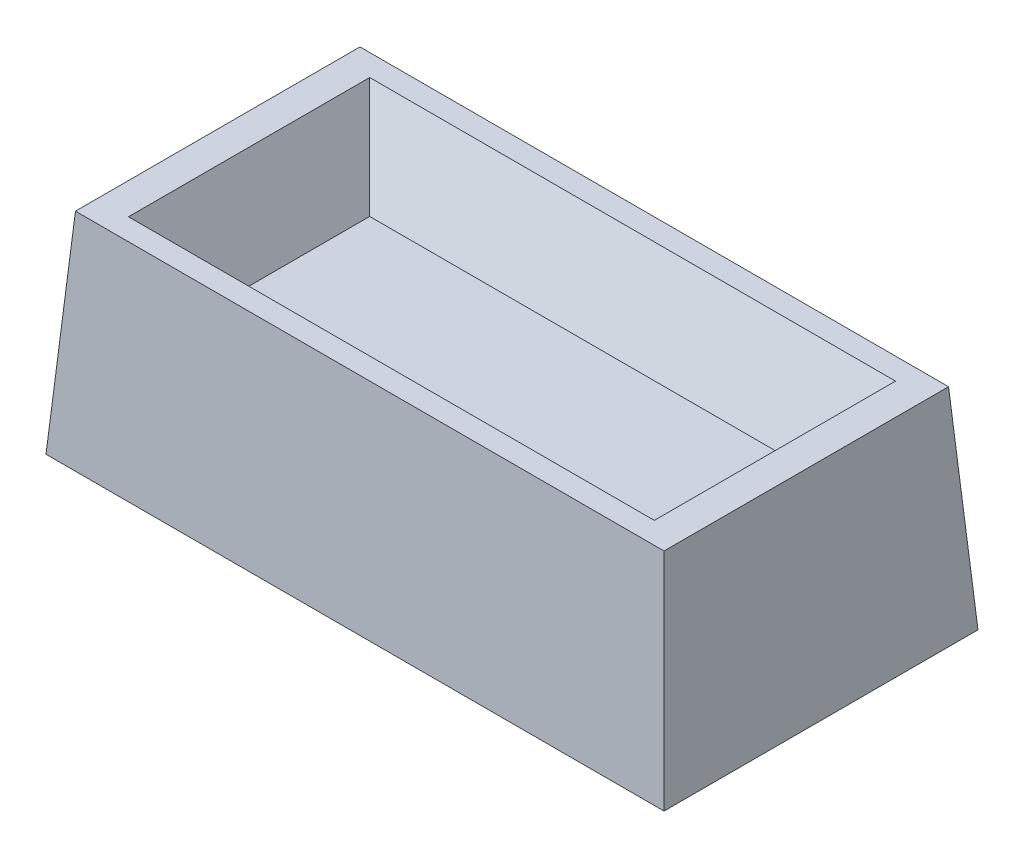
ISO-10303-21;
HEADER;
FILE_DESCRIPTION(('STEP AP214'),'2;1');
FILE_NAME('part.step','',(''),(''),'','','');
FILE_SCHEMA(('AUTOMOTIVE_DESIGN { 1 0 10303 214 1 1 1 1 }'));
ENDSEC;
DATA;
#1=APPLICATION_CONTEXT('core data for automotive mechanical design processes');
#2=APPLICATION_PROTOCOL_DEFINITION('international standard','automotive_design',2000,#1);
#3=PRODUCT_CONTEXT('',#1,'mechanical');
#4=PRODUCT('Part','Part','',(#3));
#5=PRODUCT_RELATED_PRODUCT_CATEGORY('part','',(#4));
#6=PRODUCT_DEFINITION_FORMATION('','',#4);
#7=PRODUCT_DEFINITION_CONTEXT('part definition',#1,'design');
#8=PRODUCT_DEFINITION('design','',#6,#7);
#9=PRODUCT_DEFINITION_SHAPE('','',#8);
#10=(LENGTH_UNIT() NAMED_UNIT(*) SI_UNIT(.MILLI.,.METRE.));
#11=(NAMED_UNIT(*) PLANE_ANGLE_UNIT() SI_UNIT($,.RADIAN.));
#12=(NAMED_UNIT(*) SI_UNIT($,.STERADIAN.) SOLID_ANGLE_UNIT());
#13=UNCERTAINTY_MEASURE_WITH_UNIT(LENGTH_MEASURE(1.E-05),#10,'distance_accuracy_value','');
#14=(GEOMETRIC_REPRESENTATION_CONTEXT(3) GLOBAL_UNCERTAINTY_ASSIGNED_CONTEXT((#13)) GLOBAL_UNIT_ASSIGNED_CONTEXT((#10,
#11,#12)) REPRESENTATION_CONTEXT('',''));
#15=CARTESIAN_POINT('',(0.,0.,0.));
#16=DIRECTION('',(0.,0.,1.));
#17=DIRECTION('',(1.,0.,0.));
#18=AXIS2_PLACEMENT_3D('',#15,#16,#17);
#19=CARTESIAN_POINT('',(0.,0.,0.));
#20=DIRECTION('',(0.,-1.,0.));
#21=DIRECTION('',(0.,0.,-1.));
#22=AXIS2_PLACEMENT_3D('',#19,#20,#21);
#23=PLANE('',#22);
#24=DIRECTION('',(0.,0.,-1.));
#25=VECTOR('',#24,1.);
#26=CARTESIAN_POINT('',(102.892841401862,0.,52.2673742227546));
#27=LINE('',#26,#25);
#28=CARTESIAN_POINT('',(102.892841401862,0.,52.2673742227546));
#29=VERTEX_POINT('',#28);
#30=CARTESIAN_POINT('',(102.892841401862,0.,-52.2673742227546));
#31=VERTEX_POINT('',#30);
#32=EDGE_CURVE('E240',#29,#31,#27,.T.);
#33=ORIENTED_EDGE('',*,*,#32,.F.);
#34=DIRECTION('',(1.,0.,0.));
#35=VECTOR('',#34,1.);
#36=CARTESIAN_POINT('',(-102.892841401862,0.,52.2673742227546));
#37=LINE('',#36,#35);
#38=CARTESIAN_POINT('',(-102.892841401862,0.,52.2673742227546));
#39=VERTEX_POINT('',#38);
#40=EDGE_CURVE('E247',#39,#29,#37,.T.);
#41=ORIENTED_EDGE('',*,*,#40,.F.);
#42=DIRECTION('',(0.,0.,1.));
#43=VECTOR('',#42,1.);
#44=CARTESIAN_POINT('',(-102.892841401862,0.,52.2673742227546));
#45=LINE('',#44,#43);
#46=CARTESIAN_POINT('',(-102.892841401862,0.,-52.2673742227546));
#47=VERTEX_POINT('',#46);
#48=EDGE_CURVE('E245',#47,#39,#45,.T.);
#49=ORIENTED_EDGE('',*,*,#48,.F.);
#50=DIRECTION('',(-1.,0.,0.));
#51=VECTOR('',#50,1.);
#52=CARTESIAN_POINT('',(-102.892841401862,0.,-52.2673742227546));
#53=LINE('',#52,#51);
#54=EDGE_CURVE('E243',#31,#47,#53,.T.);
#55=ORIENTED_EDGE('',*,*,#54,.F.);
#56=EDGE_LOOP('',(#33,#41,#49,#55));
#57=FACE_BOUND('',#56,.T.);
#58=DIRECTION('',(-1.,0.,0.));
#59=VECTOR('',#58,1.);
#60=CARTESIAN_POINT('',(0.,0.,50.6759977095508));
#61=LINE('',#60,#59);
#62=CARTESIAN_POINT('',(-101.301464888659,0.,50.6759977095508));
#63=VERTEX_POINT('',#62);
#64=CARTESIAN_POINT('',(101.301464888659,0.,50.6759977095508));
#65=VERTEX_POINT('',#64);
#66=EDGE_CURVE('E172',#63,#65,#61,.F.);
#67=ORIENTED_EDGE('',*,*,#66,.T.);
#68=DIRECTION('',(0.,0.,1.));
#69=VECTOR('',#68,1.);
#70=CARTESIAN_POINT('',(101.301464888659,0.,0.));
#71=LINE('',#70,#69);
#72=CARTESIAN_POINT('',(101.301464888659,0.,-50.6759977095508));
#73=VERTEX_POINT('',#72);
#74=EDGE_CURVE('E210',#65,#73,#71,.F.);
#75=ORIENTED_EDGE('',*,*,#74,.T.);
#76=DIRECTION('',(1.,0.,0.));
#77=VECTOR('',#76,1.);
#78=CARTESIAN_POINT('',(0.,0.,-50.6759977095508));
#79=LINE('',#78,#77);
#80=CARTESIAN_POINT('',(-101.301464888659,0.,-50.6759977095508));
#81=VERTEX_POINT('',#80);
#82=EDGE_CURVE('E176',#73,#81,#79,.F.);
#83=ORIENTED_EDGE('',*,*,#82,.T.);
#84=DIRECTION('',(0.,0.,-1.));
#85=VECTOR('',#84,1.);
#86=CARTESIAN_POINT('',(-101.301464888659,0.,0.));
#87=LINE('',#86,#85);
#88=EDGE_CURVE('E50',#81,#63,#87,.F.);
#89=ORIENTED_EDGE('',*,*,#88,.T.);
#90=EDGE_LOOP('',(#67,#75,#83,#89));
#91=FACE_BOUND('',#90,.T.);
#92=ADVANCED_FACE('F33',(#57,#91),#23,.T.);
#93=CARTESIAN_POINT('',(102.892841401862,0.,52.2673742227546));
#94=DIRECTION('',(0.997564050259824,0.0697564737441253,0.));
#95=DIRECTION('',(-0.0697564737441253,0.997564050259824,0.));
#96=AXIS2_PLACEMENT_3D('',#93,#94,#95);
#97=PLANE('',#96);
#98=ORIENTED_EDGE('',*,*,#32,.T.);
#99=DIRECTION('',(0.0695873743166647,-0.995145815783508,-0.0695873743166647));
#100=VECTOR('',#99,1.);
#101=CARTESIAN_POINT('',(101.896344263182,14.2505730060454,-51.2708770840736));
#102=LINE('',#101,#100);
#103=CARTESIAN_POINT('',(97.9906921773746,70.104,-47.3652249982668));
#104=VERTEX_POINT('',#103);
#105=EDGE_CURVE('E11',#104,#31,#102,.T.);
#106=ORIENTED_EDGE('',*,*,#105,.F.);
#107=DIRECTION('',(0.,0.,1.));
#108=VECTOR('',#107,1.);
#109=CARTESIAN_POINT('',(97.9906921773746,70.104,0.));
#110=LINE('',#109,#108);
#111=CARTESIAN_POINT('',(97.9906921773746,70.104,47.3652249982668));
#112=VERTEX_POINT('',#111);
#113=EDGE_CURVE('E248',#112,#104,#110,.F.);
#114=ORIENTED_EDGE('',*,*,#113,.F.);
#115=DIRECTION('',(0.0695873743166647,-0.995145815783508,0.0695873743166647));
#116=VECTOR('',#115,1.);
#117=CARTESIAN_POINT('',(102.892841401862,0.,52.2673742227546));
#118=LINE('',#117,#116);
#119=EDGE_CURVE('E250',#112,#29,#118,.T.);
#120=ORIENTED_EDGE('',*,*,#119,.T.);
#121=EDGE_LOOP('',(#98,#106,#114,#120));
#122=FACE_BOUND('',#121,.T.);
#123=ADVANCED_FACE('F299',(#122),#97,.T.);
#124=CARTESIAN_POINT('',(-102.892841401862,0.,-52.2673742227546));
#125=DIRECTION('',(0.,0.0697564737441253,-0.997564050259824));
#126=DIRECTION('',(0.,0.997564050259824,0.0697564737441253));
#127=AXIS2_PLACEMENT_3D('',#124,#125,#126);
#128=PLANE('',#127);
#129=ORIENTED_EDGE('',*,*,#54,.T.);
#130=DIRECTION('',(-0.0695873743166647,-0.995145815783508,-0.0695873743166647));
#131=VECTOR('',#130,1.);
#132=CARTESIAN_POINT('',(-102.386642057479,7.23898788339008,-51.7611748783715));
#133=LINE('',#132,#131);
#134=CARTESIAN_POINT('',(-97.9906921773746,70.104,-47.3652249982668));
#135=VERTEX_POINT('',#134);
#136=EDGE_CURVE('E42',#135,#47,#133,.T.);
#137=ORIENTED_EDGE('',*,*,#136,.F.);
#138=DIRECTION('',(1.,0.,0.));
#139=VECTOR('',#138,1.);
#140=CARTESIAN_POINT('',(0.,70.104,-47.3652249982668));
#141=LINE('',#140,#139);
#142=EDGE_CURVE('E261',#104,#135,#141,.F.);
#143=ORIENTED_EDGE('',*,*,#142,.F.);
#144=ORIENTED_EDGE('',*,*,#105,.T.);
#145=EDGE_LOOP('',(#129,#137,#143,#144));
#146=FACE_BOUND('',#145,.T.);
#147=ADVANCED_FACE('F307',(#146),#128,.T.);
#148=CARTESIAN_POINT('',(-102.892841401862,0.,52.2673742227546));
#149=DIRECTION('',(-0.997564050259824,0.0697564737441253,0.));
#150=DIRECTION('',(-0.0697564737441253,-0.997564050259824,0.));
#151=AXIS2_PLACEMENT_3D('',#148,#149,#150);
#152=PLANE('',#151);
#153=ORIENTED_EDGE('',*,*,#48,.T.);
#154=DIRECTION('',(-0.0695873743166647,-0.995145815783508,0.0695873743166647));
#155=VECTOR('',#154,1.);
#156=CARTESIAN_POINT('',(-102.892841401862,0.,52.2673742227546));
#157=LINE('',#156,#155);
#158=CARTESIAN_POINT('',(-97.9906921773746,70.104,47.3652249982668));
#159=VERTEX_POINT('',#158);
#160=EDGE_CURVE('E253',#159,#39,#157,.T.);
#161=ORIENTED_EDGE('',*,*,#160,.F.);
#162=DIRECTION('',(0.,0.,-1.));
#163=VECTOR('',#162,1.);
#164=CARTESIAN_POINT('',(-97.9906921773746,70.104,0.));
#165=LINE('',#164,#163);
#166=EDGE_CURVE('E263',#135,#159,#165,.F.);
#167=ORIENTED_EDGE('',*,*,#166,.F.);
#168=ORIENTED_EDGE('',*,*,#136,.T.);
#169=EDGE_LOOP('',(#153,#161,#167,#168));
#170=FACE_BOUND('',#169,.T.);
#171=ADVANCED_FACE('F316',(#170),#152,.T.);
#172=CARTESIAN_POINT('',(-102.892841401862,0.,52.2673742227546));
#173=DIRECTION('',(0.,0.0697564737441253,0.997564050259824));
#174=DIRECTION('',(0.,-0.997564050259824,0.0697564737441253));
#175=AXIS2_PLACEMENT_3D('',#172,#173,#174);
#176=PLANE('',#175);
#177=ORIENTED_EDGE('',*,*,#40,.T.);
#178=ORIENTED_EDGE('',*,*,#119,.F.);
#179=DIRECTION('',(-1.,0.,0.));
#180=VECTOR('',#179,1.);
#181=CARTESIAN_POINT('',(0.,70.104,47.3652249982668));
#182=LINE('',#181,#180);
#183=EDGE_CURVE('E254',#159,#112,#182,.F.);
#184=ORIENTED_EDGE('',*,*,#183,.F.);
#185=ORIENTED_EDGE('',*,*,#160,.T.);
#186=EDGE_LOOP('',(#177,#178,#184,#185));
#187=FACE_BOUND('',#186,.T.);
#188=ADVANCED_FACE('F296',(#187),#176,.T.);
#189=CARTESIAN_POINT('',(0.,70.104,0.));
#190=DIRECTION('',(0.,-1.,0.));
#191=DIRECTION('',(0.,0.,-1.));
#192=AXIS2_PLACEMENT_3D('',#189,#190,#191);
#193=PLANE('',#192);
#194=DIRECTION('',(1.,0.,0.));
#195=VECTOR('',#194,1.);
#196=CARTESIAN_POINT('',(-72.8794328331901,70.104,-40.1517457005861));
#197=LINE('',#196,#195);
#198=CARTESIAN_POINT('',(87.5441296706066,70.104,-40.1517457005861));
#199=VERTEX_POINT('',#198);
#200=CARTESIAN_POINT('',(-87.5441296706066,70.104,-40.1517457005861));
#201=VERTEX_POINT('',#200);
#202=EDGE_CURVE('E179',#199,#201,#197,.F.);
#203=ORIENTED_EDGE('',*,*,#202,.F.);
#204=DIRECTION('',(0.,0.,1.));
#205=VECTOR('',#204,1.);
#206=CARTESIAN_POINT('',(87.5441296706066,70.104,25.4870488631695));
#207=LINE('',#206,#205);
#208=CARTESIAN_POINT('',(87.5441296706066,70.104,40.1517457005861));
#209=VERTEX_POINT('',#208);
#210=EDGE_CURVE('E37',#209,#199,#207,.F.);
#211=ORIENTED_EDGE('',*,*,#210,.F.);
#212=DIRECTION('',(-1.,0.,0.));
#213=VECTOR('',#212,1.);
#214=CARTESIAN_POINT('',(-72.8794328331901,70.104,40.1517457005861));
#215=LINE('',#214,#213);
#216=CARTESIAN_POINT('',(-87.5441296706066,70.104,40.1517457005861));
#217=VERTEX_POINT('',#216);
#218=EDGE_CURVE('E230',#217,#209,#215,.F.);
#219=ORIENTED_EDGE('',*,*,#218,.F.);
#220=DIRECTION('',(0.,0.,-1.));
#221=VECTOR('',#220,1.);
#222=CARTESIAN_POINT('',(-87.5441296706066,70.104,25.4870488631695));
#223=LINE('',#222,#221);
#224=EDGE_CURVE('E272',#201,#217,#223,.F.);
#225=ORIENTED_EDGE('',*,*,#224,.F.);
#226=EDGE_LOOP('',(#203,#211,#219,#225));
#227=FACE_BOUND('',#226,.T.);
#228=ORIENTED_EDGE('',*,*,#113,.T.);
#229=ORIENTED_EDGE('',*,*,#142,.T.);
#230=ORIENTED_EDGE('',*,*,#166,.T.);
#231=ORIENTED_EDGE('',*,*,#183,.T.);
#232=EDGE_LOOP('',(#228,#229,#230,#231));
#233=FACE_BOUND('',#232,.T.);
#234=ADVANCED_FACE('F282',(#227,#233),#193,.F.);
#235=CARTESIAN_POINT('',(72.8794328331901,44.704,25.4870488631695));
#236=DIRECTION('',(-0.866025403784438,0.500000000000001,0.));
#237=DIRECTION('',(-0.500000000000001,-0.866025403784438,0.));
#238=AXIS2_PLACEMENT_3D('',#235,#236,#237);
#239=PLANE('',#238);
#240=ORIENTED_EDGE('',*,*,#210,.T.);
#241=DIRECTION('',(0.447213595499959,0.774596669241482,-0.447213595499959));
#242=VECTOR('',#241,1.);
#243=CARTESIAN_POINT('',(62.6846132879222,27.0460545735999,-15.2922293179017));
#244=LINE('',#243,#242);
#245=CARTESIAN_POINT('',(72.8794328331901,44.704,-25.4870488631695));
#246=VERTEX_POINT('',#245);
#247=EDGE_CURVE('E239',#246,#199,#244,.T.);
#248=ORIENTED_EDGE('',*,*,#247,.F.);
#249=DIRECTION('',(0.,0.,-1.));
#250=VECTOR('',#249,1.);
#251=CARTESIAN_POINT('',(72.8794328331901,44.704,25.4870488631695));
#252=LINE('',#251,#250);
#253=CARTESIAN_POINT('',(72.8794328331901,44.704,25.4870488631695));
#254=VERTEX_POINT('',#253);
#255=EDGE_CURVE('E226',#254,#246,#252,.T.);
#256=ORIENTED_EDGE('',*,*,#255,.F.);
#257=DIRECTION('',(0.447213595499959,0.774596669241482,0.447213595499959));
#258=VECTOR('',#257,1.);
#259=CARTESIAN_POINT('',(43.727659699914,-5.78835219755546,-3.66472427010659));
#260=LINE('',#259,#258);
#261=EDGE_CURVE('E71',#254,#209,#260,.T.);
#262=ORIENTED_EDGE('',*,*,#261,.T.);
#263=EDGE_LOOP('',(#240,#248,#256,#262));
#264=FACE_BOUND('',#263,.T.);
#265=ADVANCED_FACE('F287',(#264),#239,.T.);
#266=CARTESIAN_POINT('',(-72.8794328331901,44.704,25.4870488631695));
#267=DIRECTION('',(0.,0.500000000000001,-0.866025403784438));
#268=DIRECTION('',(0.,0.866025403784438,0.500000000000001));
#269=AXIS2_PLACEMENT_3D('',#266,#267,#268);
#270=PLANE('',#269);
#271=ORIENTED_EDGE('',*,*,#218,.T.);
#272=ORIENTED_EDGE('',*,*,#261,.F.);
#273=DIRECTION('',(1.,0.,0.));
#274=VECTOR('',#273,1.);
#275=CARTESIAN_POINT('',(-72.8794328331901,44.704,25.4870488631695));
#276=LINE('',#275,#274);
#277=CARTESIAN_POINT('',(-72.8794328331901,44.704,25.4870488631695));
#278=VERTEX_POINT('',#277);
#279=EDGE_CURVE('E236',#278,#254,#276,.T.);
#280=ORIENTED_EDGE('',*,*,#279,.F.);
#281=DIRECTION('',(-0.447213595499959,0.774596669241482,0.447213595499959));
#282=VECTOR('',#281,1.);
#283=CARTESIAN_POINT('',(-72.8794328331901,44.704,25.4870488631695));
#284=LINE('',#283,#282);
#285=EDGE_CURVE('E79',#278,#217,#284,.T.);
#286=ORIENTED_EDGE('',*,*,#285,.T.);
#287=EDGE_LOOP('',(#271,#272,#280,#286));
#288=FACE_BOUND('',#287,.T.);
#289=ADVANCED_FACE('F289',(#288),#270,.T.);
#290=CARTESIAN_POINT('',(-72.8794328331901,44.704,25.4870488631695));
#291=DIRECTION('',(0.866025403784438,0.500000000000001,0.));
#292=DIRECTION('',(-0.500000000000001,0.866025403784438,0.));
#293=AXIS2_PLACEMENT_3D('',#290,#291,#292);
#294=PLANE('',#293);
#295=ORIENTED_EDGE('',*,*,#224,.T.);
#296=ORIENTED_EDGE('',*,*,#285,.F.);
#297=DIRECTION('',(0.,0.,1.));
#298=VECTOR('',#297,1.);
#299=CARTESIAN_POINT('',(-72.8794328331901,44.704,25.4870488631695));
#300=LINE('',#299,#298);
#301=CARTESIAN_POINT('',(-72.8794328331901,44.704,-25.4870488631695));
#302=VERTEX_POINT('',#301);
#303=EDGE_CURVE('E233',#302,#278,#300,.T.);
#304=ORIENTED_EDGE('',*,*,#303,.F.);
#305=DIRECTION('',(-0.447213595499959,0.774596669241482,-0.447213595499959));
#306=VECTOR('',#305,1.);
#307=CARTESIAN_POINT('',(-72.8794328331901,44.704,-25.4870488631695));
#308=LINE('',#307,#306);
#309=EDGE_CURVE('E268',#302,#201,#308,.T.);
#310=ORIENTED_EDGE('',*,*,#309,.T.);
#311=EDGE_LOOP('',(#295,#296,#304,#310));
#312=FACE_BOUND('',#311,.T.);
#313=ADVANCED_FACE('F35',(#312),#294,.T.);
#314=CARTESIAN_POINT('',(-72.8794328331901,44.704,-25.4870488631695));
#315=DIRECTION('',(0.,0.500000000000001,0.866025403784438));
#316=DIRECTION('',(0.,-0.866025403784438,0.500000000000001));
#317=AXIS2_PLACEMENT_3D('',#314,#315,#316);
#318=PLANE('',#317);
#319=ORIENTED_EDGE('',*,*,#202,.T.);
#320=ORIENTED_EDGE('',*,*,#309,.F.);
#321=DIRECTION('',(-1.,0.,0.));
#322=VECTOR('',#321,1.);
#323=CARTESIAN_POINT('',(-72.8794328331901,44.704,-25.4870488631695));
#324=LINE('',#323,#322);
#325=EDGE_CURVE('E229',#246,#302,#324,.T.);
#326=ORIENTED_EDGE('',*,*,#325,.F.);
#327=ORIENTED_EDGE('',*,*,#247,.T.);
#328=EDGE_LOOP('',(#319,#320,#326,#327));
#329=FACE_BOUND('',#328,.T.);
#330=ADVANCED_FACE('F277',(#329),#318,.T.);
#331=CARTESIAN_POINT('',(0.,44.704,0.));
#332=DIRECTION('',(0.,-1.,0.));
#333=DIRECTION('',(0.,0.,-1.));
#334=AXIS2_PLACEMENT_3D('',#331,#332,#333);
#335=PLANE('',#334);
#336=ORIENTED_EDGE('',*,*,#255,.T.);
#337=ORIENTED_EDGE('',*,*,#325,.T.);
#338=ORIENTED_EDGE('',*,*,#303,.T.);
#339=ORIENTED_EDGE('',*,*,#279,.T.);
#340=EDGE_LOOP('',(#336,#337,#338,#339));
#341=FACE_BOUND('',#340,.T.);
#342=ADVANCED_FACE('F286',(#341),#335,.F.);
#343=CARTESIAN_POINT('',(101.309208472075,-0.110738402068799,52.2673742227546));
#344=DIRECTION('',(0.997564050259824,0.0697564737441253,0.));
#345=DIRECTION('',(-0.0697564737441253,0.997564050259824,0.));
#346=AXIS2_PLACEMENT_3D('',#343,#344,#345);
#347=PLANE('',#346);
#348=ORIENTED_EDGE('',*,*,#74,.F.);
#349=DIRECTION('',(0.0695873743166647,-0.995145815783508,0.0695873743166647));
#350=VECTOR('',#349,1.);
#351=CARTESIAN_POINT('',(101.316877060393,-0.220404324271164,50.6914098812856));
#352=LINE('',#351,#350);
#353=CARTESIAN_POINT('',(96.5103244781311,68.5165,45.8848572990232));
#354=VERTEX_POINT('',#353);
#355=EDGE_CURVE('E171',#354,#65,#352,.T.);
#356=ORIENTED_EDGE('',*,*,#355,.F.);
#357=DIRECTION('',(0.,0.,1.));
#358=VECTOR('',#357,1.);
#359=CARTESIAN_POINT('',(96.5103244781311,68.5165,0.));
#360=LINE('',#359,#358);
#361=CARTESIAN_POINT('',(96.5103244781311,68.5165,-45.8848572990232));
#362=VERTEX_POINT('',#361);
#363=EDGE_CURVE('E159',#354,#362,#360,.F.);
#364=ORIENTED_EDGE('',*,*,#363,.T.);
#365=DIRECTION('',(0.0695873743166647,-0.995145815783508,-0.0695873743166647));
#366=VECTOR('',#365,1.);
#367=CARTESIAN_POINT('',(100.320379921713,14.0301686817742,-49.6949127426046));
#368=LINE('',#367,#366);
#369=EDGE_CURVE('E169',#362,#73,#368,.T.);
#370=ORIENTED_EDGE('',*,*,#369,.T.);
#371=EDGE_LOOP('',(#348,#356,#364,#370));
#372=FACE_BOUND('',#371,.T.);
#373=ADVANCED_FACE('F168',(#372),#347,.F.);
#374=CARTESIAN_POINT('',(-102.892841401862,-0.110738402068799,-50.6837412929672));
#375=DIRECTION('',(0.,0.0697564737441253,-0.997564050259824));
#376=DIRECTION('',(0.,0.997564050259824,0.0697564737441253));
#377=AXIS2_PLACEMENT_3D('',#374,#375,#376);
#378=PLANE('',#377);
#379=ORIENTED_EDGE('',*,*,#82,.F.);
#380=ORIENTED_EDGE('',*,*,#369,.F.);
#381=DIRECTION('',(1.,0.,0.));
#382=VECTOR('',#381,1.);
#383=CARTESIAN_POINT('',(0.,68.5165,-45.8848572990232));
#384=LINE('',#383,#382);
#385=CARTESIAN_POINT('',(-96.5103244781311,68.5165,-45.8848572990232));
#386=VERTEX_POINT('',#385);
#387=EDGE_CURVE('E155',#362,#386,#384,.F.);
#388=ORIENTED_EDGE('',*,*,#387,.T.);
#389=DIRECTION('',(-0.0695873743166647,-0.995145815783508,-0.0695873743166647));
#390=VECTOR('',#389,1.);
#391=CARTESIAN_POINT('',(-100.81067771601,7.01858355911892,-50.1852105369025));
#392=LINE('',#391,#390);
#393=EDGE_CURVE('E177',#386,#81,#392,.T.);
#394=ORIENTED_EDGE('',*,*,#393,.T.);
#395=EDGE_LOOP('',(#379,#380,#388,#394));
#396=FACE_BOUND('',#395,.T.);
#397=ADVANCED_FACE('F174',(#396),#378,.F.);
#398=CARTESIAN_POINT('',(-101.309208472075,-0.110738402068799,52.2673742227546));
#399=DIRECTION('',(-0.997564050259824,0.0697564737441253,0.));
#400=DIRECTION('',(-0.0697564737441253,-0.997564050259824,0.));
#401=AXIS2_PLACEMENT_3D('',#398,#399,#400);
#402=PLANE('',#401);
#403=ORIENTED_EDGE('',*,*,#88,.F.);
#404=ORIENTED_EDGE('',*,*,#393,.F.);
#405=DIRECTION('',(0.,0.,-1.));
#406=VECTOR('',#405,1.);
#407=CARTESIAN_POINT('',(-96.5103244781311,68.5165,0.));
#408=LINE('',#407,#406);
#409=CARTESIAN_POINT('',(-96.5103244781311,68.5165,45.8848572990232));
#410=VERTEX_POINT('',#409);
#411=EDGE_CURVE('E160',#386,#410,#408,.F.);
#412=ORIENTED_EDGE('',*,*,#411,.T.);
#413=DIRECTION('',(-0.0695873743166647,-0.995145815783508,0.0695873743166647));
#414=VECTOR('',#413,1.);
#415=CARTESIAN_POINT('',(-101.316877060393,-0.220404324271164,50.6914098812856));
#416=LINE('',#415,#414);
#417=EDGE_CURVE('E180',#410,#63,#416,.T.);
#418=ORIENTED_EDGE('',*,*,#417,.T.);
#419=EDGE_LOOP('',(#403,#404,#412,#418));
#420=FACE_BOUND('',#419,.T.);
#421=ADVANCED_FACE('F395',(#420),#402,.F.);
#422=CARTESIAN_POINT('',(-102.892841401862,-0.110738402068799,50.6837412929672));
#423=DIRECTION('',(0.,0.0697564737441253,0.997564050259824));
#424=DIRECTION('',(0.,-0.997564050259824,0.0697564737441253));
#425=AXIS2_PLACEMENT_3D('',#422,#423,#424);
#426=PLANE('',#425);
#427=ORIENTED_EDGE('',*,*,#66,.F.);
#428=ORIENTED_EDGE('',*,*,#417,.F.);
#429=DIRECTION('',(-1.,0.,0.));
#430=VECTOR('',#429,1.);
#431=CARTESIAN_POINT('',(0.,68.5165,45.8848572990232));
#432=LINE('',#431,#430);
#433=EDGE_CURVE('E183',#410,#354,#432,.F.);
#434=ORIENTED_EDGE('',*,*,#433,.T.);
#435=ORIENTED_EDGE('',*,*,#355,.T.);
#436=EDGE_LOOP('',(#427,#428,#434,#435));
#437=FACE_BOUND('',#436,.T.);
#438=ADVANCED_FACE('F403',(#437),#426,.F.);
#439=CARTESIAN_POINT('',(0.,68.5165,0.));
#440=DIRECTION('',(0.,-1.,0.));
#441=DIRECTION('',(0.,0.,-1.));
#442=AXIS2_PLACEMENT_3D('',#439,#440,#441);
#443=PLANE('',#442);
#444=DIRECTION('',(1.,0.,0.));
#445=VECTOR('',#444,1.);
#446=CARTESIAN_POINT('',(-72.8794328331901,68.5165,-41.0682892529246));
#447=LINE('',#446,#445);
#448=CARTESIAN_POINT('',(88.4606732229451,68.5165,-41.0682892529246));
#449=VERTEX_POINT('',#448);
#450=CARTESIAN_POINT('',(-88.4606732229451,68.5165,-41.0682892529246));
#451=VERTEX_POINT('',#450);
#452=EDGE_CURVE('E188',#449,#451,#447,.F.);
#453=ORIENTED_EDGE('',*,*,#452,.T.);
#454=DIRECTION('',(0.,0.,-1.));
#455=VECTOR('',#454,1.);
#456=CARTESIAN_POINT('',(-88.4606732229451,68.5165,25.4870488631695));
#457=LINE('',#456,#455);
#458=CARTESIAN_POINT('',(-88.4606732229451,68.5165,41.0682892529246));
#459=VERTEX_POINT('',#458);
#460=EDGE_CURVE('E191',#451,#459,#457,.F.);
#461=ORIENTED_EDGE('',*,*,#460,.T.);
#462=DIRECTION('',(-1.,0.,0.));
#463=VECTOR('',#462,1.);
#464=CARTESIAN_POINT('',(-72.8794328331901,68.5165,41.0682892529246));
#465=LINE('',#464,#463);
#466=CARTESIAN_POINT('',(88.4606732229451,68.5165,41.0682892529246));
#467=VERTEX_POINT('',#466);
#468=EDGE_CURVE('E194',#459,#467,#465,.F.);
#469=ORIENTED_EDGE('',*,*,#468,.T.);
#470=DIRECTION('',(0.,0.,1.));
#471=VECTOR('',#470,1.);
#472=CARTESIAN_POINT('',(88.4606732229451,68.5165,25.4870488631695));
#473=LINE('',#472,#471);
#474=EDGE_CURVE('E192',#467,#449,#473,.F.);
#475=ORIENTED_EDGE('',*,*,#474,.T.);
#476=EDGE_LOOP('',(#453,#461,#469,#475));
#477=FACE_BOUND('',#476,.T.);
#478=ORIENTED_EDGE('',*,*,#363,.F.);
#479=ORIENTED_EDGE('',*,*,#433,.F.);
#480=ORIENTED_EDGE('',*,*,#411,.F.);
#481=ORIENTED_EDGE('',*,*,#387,.F.);
#482=EDGE_LOOP('',(#478,#479,#480,#481));
#483=FACE_BOUND('',#482,.T.);
#484=ADVANCED_FACE('F157',(#477,#483),#443,.T.);
#485=CARTESIAN_POINT('',(74.2542481616979,43.91025,25.4870488631695));
#486=DIRECTION('',(-0.866025403784438,0.500000000000001,0.));
#487=DIRECTION('',(-0.500000000000001,-0.866025403784438,0.));
#488=AXIS2_PLACEMENT_3D('',#485,#486,#487);
#489=PLANE('',#488);
#490=ORIENTED_EDGE('',*,*,#474,.F.);
#491=DIRECTION('',(0.447213595499959,0.774596669241482,0.447213595499959));
#492=VECTOR('',#491,1.);
#493=CARTESIAN_POINT('',(44.8275119627202,-7.05835219755546,-2.56487200730035));
#494=LINE('',#493,#492);
#495=CARTESIAN_POINT('',(73.7959763855286,43.1165,26.4035924155081));
#496=VERTEX_POINT('',#495);
#497=EDGE_CURVE('E208',#496,#467,#494,.T.);
#498=ORIENTED_EDGE('',*,*,#497,.F.);
#499=DIRECTION('',(0.,0.,1.));
#500=VECTOR('',#499,1.);
#501=CARTESIAN_POINT('',(73.7959763855286,43.1165,25.4870488631695));
#502=LINE('',#501,#500);
#503=CARTESIAN_POINT('',(73.7959763855286,43.1165,-26.4035924155081));
#504=VERTEX_POINT('',#503);
#505=EDGE_CURVE('E197',#496,#504,#502,.F.);
#506=ORIENTED_EDGE('',*,*,#505,.T.);
#507=DIRECTION('',(0.447213595499959,0.774596669241482,-0.447213595499959));
#508=VECTOR('',#507,1.);
#509=CARTESIAN_POINT('',(63.7844655507285,25.7760545735999,-16.3920815807079));
#510=LINE('',#509,#508);
#511=EDGE_CURVE('E200',#504,#449,#510,.T.);
#512=ORIENTED_EDGE('',*,*,#511,.T.);
#513=EDGE_LOOP('',(#490,#498,#506,#512));
#514=FACE_BOUND('',#513,.T.);
#515=ADVANCED_FACE('F419',(#514),#489,.F.);
#516=CARTESIAN_POINT('',(-72.8794328331901,43.91025,26.8618641916773));
#517=DIRECTION('',(0.,0.500000000000001,-0.866025403784438));
#518=DIRECTION('',(0.,0.866025403784438,0.500000000000001));
#519=AXIS2_PLACEMENT_3D('',#516,#517,#518);
#520=PLANE('',#519);
#521=ORIENTED_EDGE('',*,*,#468,.F.);
#522=DIRECTION('',(-0.447213595499959,0.774596669241482,0.447213595499959));
#523=VECTOR('',#522,1.);
#524=CARTESIAN_POINT('',(-73.9792850959963,43.434,26.5869011259758));
#525=LINE('',#524,#523);
#526=CARTESIAN_POINT('',(-73.7959763855286,43.1165,26.4035924155081));
#527=VERTEX_POINT('',#526);
#528=EDGE_CURVE('E211',#527,#459,#525,.T.);
#529=ORIENTED_EDGE('',*,*,#528,.F.);
#530=DIRECTION('',(-1.,0.,0.));
#531=VECTOR('',#530,1.);
#532=CARTESIAN_POINT('',(-72.8794328331901,43.1165,26.4035924155081));
#533=LINE('',#532,#531);
#534=EDGE_CURVE('E204',#527,#496,#533,.F.);
#535=ORIENTED_EDGE('',*,*,#534,.T.);
#536=ORIENTED_EDGE('',*,*,#497,.T.);
#537=EDGE_LOOP('',(#521,#529,#535,#536));
#538=FACE_BOUND('',#537,.T.);
#539=ADVANCED_FACE('F428',(#538),#520,.F.);
#540=CARTESIAN_POINT('',(-74.2542481616979,43.91025,25.4870488631695));
#541=DIRECTION('',(0.866025403784438,0.500000000000001,0.));
#542=DIRECTION('',(-0.500000000000001,0.866025403784438,0.));
#543=AXIS2_PLACEMENT_3D('',#540,#541,#542);
#544=PLANE('',#543);
#545=ORIENTED_EDGE('',*,*,#460,.F.);
#546=DIRECTION('',(-0.447213595499959,0.774596669241482,-0.447213595499959));
#547=VECTOR('',#546,1.);
#548=CARTESIAN_POINT('',(-73.9792850959963,43.434,-26.5869011259758));
#549=LINE('',#548,#547);
#550=CARTESIAN_POINT('',(-73.7959763855286,43.1165,-26.4035924155081));
#551=VERTEX_POINT('',#550);
#552=EDGE_CURVE('E203',#551,#451,#549,.T.);
#553=ORIENTED_EDGE('',*,*,#552,.F.);
#554=DIRECTION('',(0.,0.,-1.));
#555=VECTOR('',#554,1.);
#556=CARTESIAN_POINT('',(-73.7959763855286,43.1165,25.4870488631695));
#557=LINE('',#556,#555);
#558=EDGE_CURVE('E214',#551,#527,#557,.F.);
#559=ORIENTED_EDGE('',*,*,#558,.T.);
#560=ORIENTED_EDGE('',*,*,#528,.T.);
#561=EDGE_LOOP('',(#545,#553,#559,#560));
#562=FACE_BOUND('',#561,.T.);
#563=ADVANCED_FACE('F437',(#562),#544,.F.);
#564=CARTESIAN_POINT('',(-72.8794328331901,43.91025,-26.8618641916773));
#565=DIRECTION('',(0.,0.500000000000001,0.866025403784438));
#566=DIRECTION('',(0.,-0.866025403784438,0.500000000000001));
#567=AXIS2_PLACEMENT_3D('',#564,#565,#566);
#568=PLANE('',#567);
#569=ORIENTED_EDGE('',*,*,#452,.F.);
#570=ORIENTED_EDGE('',*,*,#511,.F.);
#571=DIRECTION('',(1.,0.,0.));
#572=VECTOR('',#571,1.);
#573=CARTESIAN_POINT('',(-72.8794328331901,43.1165,-26.4035924155081));
#574=LINE('',#573,#572);
#575=EDGE_CURVE('E207',#504,#551,#574,.F.);
#576=ORIENTED_EDGE('',*,*,#575,.T.);
#577=ORIENTED_EDGE('',*,*,#552,.T.);
#578=EDGE_LOOP('',(#569,#570,#576,#577));
#579=FACE_BOUND('',#578,.T.);
#580=ADVANCED_FACE('F446',(#579),#568,.F.);
#581=CARTESIAN_POINT('',(0.,43.1165,0.));
#582=DIRECTION('',(0.,-1.,0.));
#583=DIRECTION('',(0.,0.,-1.));
#584=AXIS2_PLACEMENT_3D('',#581,#582,#583);
#585=PLANE('',#584);
#586=ORIENTED_EDGE('',*,*,#505,.F.);
#587=ORIENTED_EDGE('',*,*,#534,.F.);
#588=ORIENTED_EDGE('',*,*,#558,.F.);
#589=ORIENTED_EDGE('',*,*,#575,.F.);
#590=EDGE_LOOP('',(#586,#587,#588,#589));
#591=FACE_BOUND('',#590,.T.);
#592=ADVANCED_FACE('F455',(#591),#585,.T.);
#593=CLOSED_SHELL('',(#92,#123,#147,#171,#188,#234,#265,#289,#313,#330,#342,#373,#397,#421,#438,
#484,#515,#539,#563,#580,#592));
#594=MANIFOLD_SOLID_BREP('B2',#593);
#595=ADVANCED_BREP_SHAPE_REPRESENTATION('',(#18,#594),#14);
#596=SHAPE_DEFINITION_REPRESENTATION(#9,#595);
ENDSEC;
END-ISO-10303-21;
